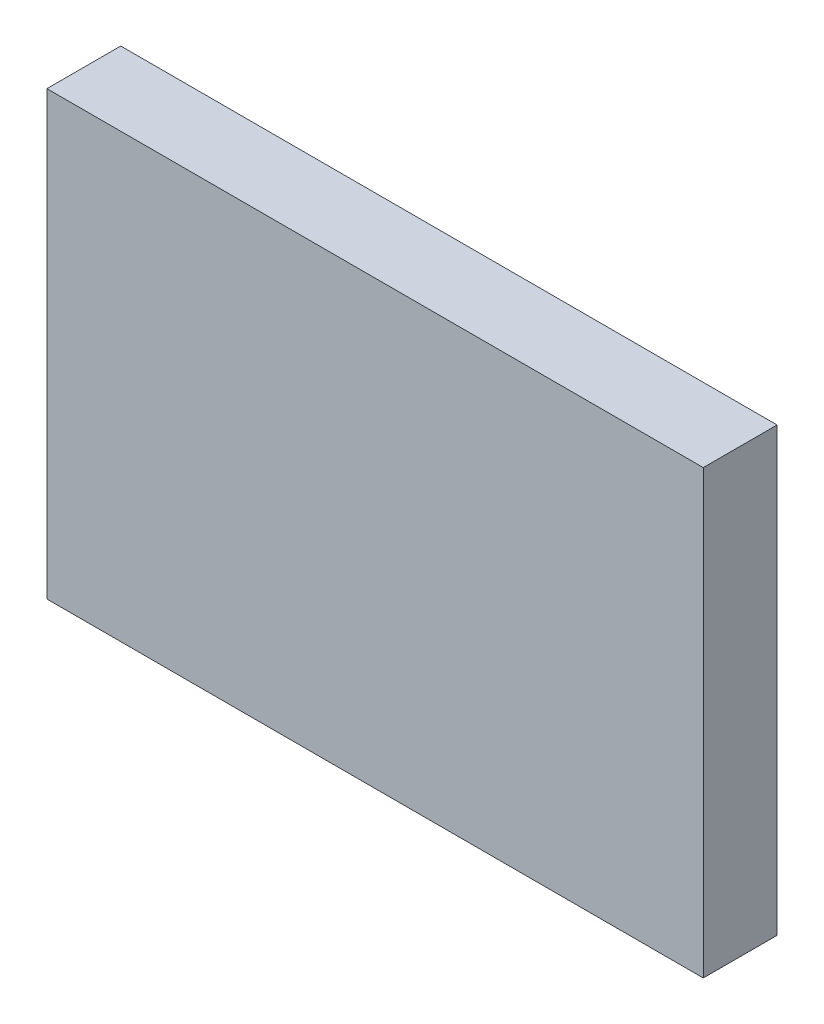
ISO-10303-21;
HEADER;
FILE_DESCRIPTION(('STEP AP214'),'2;1');
FILE_NAME('part.step','',(''),(''),'','','');
FILE_SCHEMA(('AUTOMOTIVE_DESIGN { 1 0 10303 214 1 1 1 1 }'));
ENDSEC;
DATA;
#1=APPLICATION_CONTEXT('core data for automotive mechanical design processes');
#2=APPLICATION_PROTOCOL_DEFINITION('international standard','automotive_design',2000,#1);
#3=PRODUCT_CONTEXT('',#1,'mechanical');
#4=PRODUCT('Part','Part','',(#3));
#5=PRODUCT_RELATED_PRODUCT_CATEGORY('part','',(#4));
#6=PRODUCT_DEFINITION_FORMATION('','',#4);
#7=PRODUCT_DEFINITION_CONTEXT('part definition',#1,'design');
#8=PRODUCT_DEFINITION('design','',#6,#7);
#9=PRODUCT_DEFINITION_SHAPE('','',#8);
#10=(LENGTH_UNIT() NAMED_UNIT(*) SI_UNIT(.MILLI.,.METRE.));
#11=(NAMED_UNIT(*) PLANE_ANGLE_UNIT() SI_UNIT($,.RADIAN.));
#12=(NAMED_UNIT(*) SI_UNIT($,.STERADIAN.) SOLID_ANGLE_UNIT());
#13=UNCERTAINTY_MEASURE_WITH_UNIT(LENGTH_MEASURE(1.E-05),#10,'distance_accuracy_value','');
#14=(GEOMETRIC_REPRESENTATION_CONTEXT(3) GLOBAL_UNCERTAINTY_ASSIGNED_CONTEXT((#13)) GLOBAL_UNIT_ASSIGNED_CONTEXT((#10,
#11,#12)) REPRESENTATION_CONTEXT('',''));
#15=CARTESIAN_POINT('',(0.,0.,0.));
#16=DIRECTION('',(0.,0.,1.));
#17=DIRECTION('',(1.,0.,0.));
#18=AXIS2_PLACEMENT_3D('',#15,#16,#17);
#19=CARTESIAN_POINT('',(3.1115,-2.0955,0.));
#20=DIRECTION('',(-1.,0.,0.));
#21=DIRECTION('',(0.,0.,1.));
#22=AXIS2_PLACEMENT_3D('',#19,#20,#21);
#23=PLANE('',#22);
#24=DIRECTION('',(0.,1.,0.));
#25=VECTOR('',#24,1.);
#26=CARTESIAN_POINT('',(3.1115,-2.0955,0.));
#27=LINE('',#26,#25);
#28=CARTESIAN_POINT('',(3.1115,-2.0955,0.));
#29=VERTEX_POINT('',#28);
#30=CARTESIAN_POINT('',(3.1115,2.0955,0.));
#31=VERTEX_POINT('',#30);
#32=EDGE_CURVE('E11',#29,#31,#27,.T.);
#33=ORIENTED_EDGE('',*,*,#32,.T.);
#34=DIRECTION('',(0.,0.,1.));
#35=VECTOR('',#34,1.);
#36=CARTESIAN_POINT('',(3.1115,2.0955,0.));
#37=LINE('',#36,#35);
#38=CARTESIAN_POINT('',(3.1115,2.0955,0.6999986));
#39=VERTEX_POINT('',#38);
#40=EDGE_CURVE('E28',#31,#39,#37,.T.);
#41=ORIENTED_EDGE('',*,*,#40,.T.);
#42=DIRECTION('',(0.,1.,0.));
#43=VECTOR('',#42,1.);
#44=CARTESIAN_POINT('',(3.1115,-2.0955,0.6999986));
#45=LINE('',#44,#43);
#46=CARTESIAN_POINT('',(3.1115,-2.0955,0.6999986));
#47=VERTEX_POINT('',#46);
#48=EDGE_CURVE('E94',#47,#39,#45,.T.);
#49=ORIENTED_EDGE('',*,*,#48,.F.);
#50=DIRECTION('',(0.,0.,1.));
#51=VECTOR('',#50,1.);
#52=CARTESIAN_POINT('',(3.1115,-2.0955,0.));
#53=LINE('',#52,#51);
#54=EDGE_CURVE('E89',#29,#47,#53,.T.);
#55=ORIENTED_EDGE('',*,*,#54,.F.);
#56=EDGE_LOOP('',(#33,#41,#49,#55));
#57=FACE_BOUND('',#56,.T.);
#58=ADVANCED_FACE('F17',(#57),#23,.F.);
#59=CARTESIAN_POINT('',(3.1115,2.0955,0.));
#60=DIRECTION('',(0.,-1.,0.));
#61=DIRECTION('',(0.,0.,-1.));
#62=AXIS2_PLACEMENT_3D('',#59,#60,#61);
#63=PLANE('',#62);
#64=DIRECTION('',(-1.,0.,0.));
#65=VECTOR('',#64,1.);
#66=CARTESIAN_POINT('',(3.1115,2.0955,0.));
#67=LINE('',#66,#65);
#68=CARTESIAN_POINT('',(-3.1115,2.0955,0.));
#69=VERTEX_POINT('',#68);
#70=EDGE_CURVE('E98',#31,#69,#67,.T.);
#71=ORIENTED_EDGE('',*,*,#70,.T.);
#72=DIRECTION('',(0.,0.,1.));
#73=VECTOR('',#72,1.);
#74=CARTESIAN_POINT('',(-3.1115,2.0955,0.));
#75=LINE('',#74,#73);
#76=CARTESIAN_POINT('',(-3.1115,2.0955,0.6999986));
#77=VERTEX_POINT('',#76);
#78=EDGE_CURVE('E81',#69,#77,#75,.T.);
#79=ORIENTED_EDGE('',*,*,#78,.T.);
#80=DIRECTION('',(-1.,0.,0.));
#81=VECTOR('',#80,1.);
#82=CARTESIAN_POINT('',(3.1115,2.0955,0.6999986));
#83=LINE('',#82,#81);
#84=EDGE_CURVE('E101',#39,#77,#83,.T.);
#85=ORIENTED_EDGE('',*,*,#84,.F.);
#86=ORIENTED_EDGE('',*,*,#40,.F.);
#87=EDGE_LOOP('',(#71,#79,#85,#86));
#88=FACE_BOUND('',#87,.T.);
#89=ADVANCED_FACE('F19',(#88),#63,.F.);
#90=CARTESIAN_POINT('',(-3.1115,2.0955,0.));
#91=DIRECTION('',(1.,0.,0.));
#92=DIRECTION('',(0.,1.,0.));
#93=AXIS2_PLACEMENT_3D('',#90,#91,#92);
#94=PLANE('',#93);
#95=DIRECTION('',(0.,-1.,0.));
#96=VECTOR('',#95,1.);
#97=CARTESIAN_POINT('',(-3.1115,2.0955,0.));
#98=LINE('',#97,#96);
#99=CARTESIAN_POINT('',(-3.1115,-2.0955,0.));
#100=VERTEX_POINT('',#99);
#101=EDGE_CURVE('E77',#69,#100,#98,.T.);
#102=ORIENTED_EDGE('',*,*,#101,.T.);
#103=DIRECTION('',(0.,0.,1.));
#104=VECTOR('',#103,1.);
#105=CARTESIAN_POINT('',(-3.1115,-2.0955,0.));
#106=LINE('',#105,#104);
#107=CARTESIAN_POINT('',(-3.1115,-2.0955,0.6999986));
#108=VERTEX_POINT('',#107);
#109=EDGE_CURVE('E21',#100,#108,#106,.T.);
#110=ORIENTED_EDGE('',*,*,#109,.T.);
#111=DIRECTION('',(0.,-1.,0.));
#112=VECTOR('',#111,1.);
#113=CARTESIAN_POINT('',(-3.1115,2.0955,0.6999986));
#114=LINE('',#113,#112);
#115=EDGE_CURVE('E103',#77,#108,#114,.T.);
#116=ORIENTED_EDGE('',*,*,#115,.F.);
#117=ORIENTED_EDGE('',*,*,#78,.F.);
#118=EDGE_LOOP('',(#102,#110,#116,#117));
#119=FACE_BOUND('',#118,.T.);
#120=ADVANCED_FACE('F79',(#119),#94,.F.);
#121=CARTESIAN_POINT('',(-3.1115,-2.0955,0.));
#122=DIRECTION('',(0.,1.,0.));
#123=DIRECTION('',(1.,0.,0.));
#124=AXIS2_PLACEMENT_3D('',#121,#122,#123);
#125=PLANE('',#124);
#126=DIRECTION('',(1.,0.,0.));
#127=VECTOR('',#126,1.);
#128=CARTESIAN_POINT('',(-3.1115,-2.0955,0.));
#129=LINE('',#128,#127);
#130=EDGE_CURVE('E71',#100,#29,#129,.T.);
#131=ORIENTED_EDGE('',*,*,#130,.T.);
#132=ORIENTED_EDGE('',*,*,#54,.T.);
#133=DIRECTION('',(1.,0.,0.));
#134=VECTOR('',#133,1.);
#135=CARTESIAN_POINT('',(-3.1115,-2.0955,0.6999986));
#136=LINE('',#135,#134);
#137=EDGE_CURVE('E73',#108,#47,#136,.T.);
#138=ORIENTED_EDGE('',*,*,#137,.F.);
#139=ORIENTED_EDGE('',*,*,#109,.F.);
#140=EDGE_LOOP('',(#131,#132,#138,#139));
#141=FACE_BOUND('',#140,.T.);
#142=ADVANCED_FACE('F68',(#141),#125,.F.);
#143=CARTESIAN_POINT('',(3.1115,-2.0955,0.));
#144=DIRECTION('',(0.,0.,-1.));
#145=DIRECTION('',(0.,-1.,0.));
#146=AXIS2_PLACEMENT_3D('',#143,#144,#145);
#147=PLANE('',#146);
#148=ORIENTED_EDGE('',*,*,#130,.F.);
#149=ORIENTED_EDGE('',*,*,#101,.F.);
#150=ORIENTED_EDGE('',*,*,#70,.F.);
#151=ORIENTED_EDGE('',*,*,#32,.F.);
#152=EDGE_LOOP('',(#148,#149,#150,#151));
#153=FACE_BOUND('',#152,.T.);
#154=ADVANCED_FACE('F87',(#153),#147,.T.);
#155=CARTESIAN_POINT('',(3.1115,-2.0955,0.6999986));
#156=DIRECTION('',(0.,0.,-1.));
#157=DIRECTION('',(0.,-1.,0.));
#158=AXIS2_PLACEMENT_3D('',#155,#156,#157);
#159=PLANE('',#158);
#160=ORIENTED_EDGE('',*,*,#48,.T.);
#161=ORIENTED_EDGE('',*,*,#84,.T.);
#162=ORIENTED_EDGE('',*,*,#115,.T.);
#163=ORIENTED_EDGE('',*,*,#137,.T.);
#164=EDGE_LOOP('',(#160,#161,#162,#163));
#165=FACE_BOUND('',#164,.T.);
#166=ADVANCED_FACE('F127',(#165),#159,.F.);
#167=CLOSED_SHELL('',(#58,#89,#120,#142,#154,#166));
#168=MANIFOLD_SOLID_BREP('B1',#167);
#169=ADVANCED_BREP_SHAPE_REPRESENTATION('',(#18,#168),#14);
#170=SHAPE_DEFINITION_REPRESENTATION(#9,#169);
ENDSEC;
END-ISO-10303-21;
